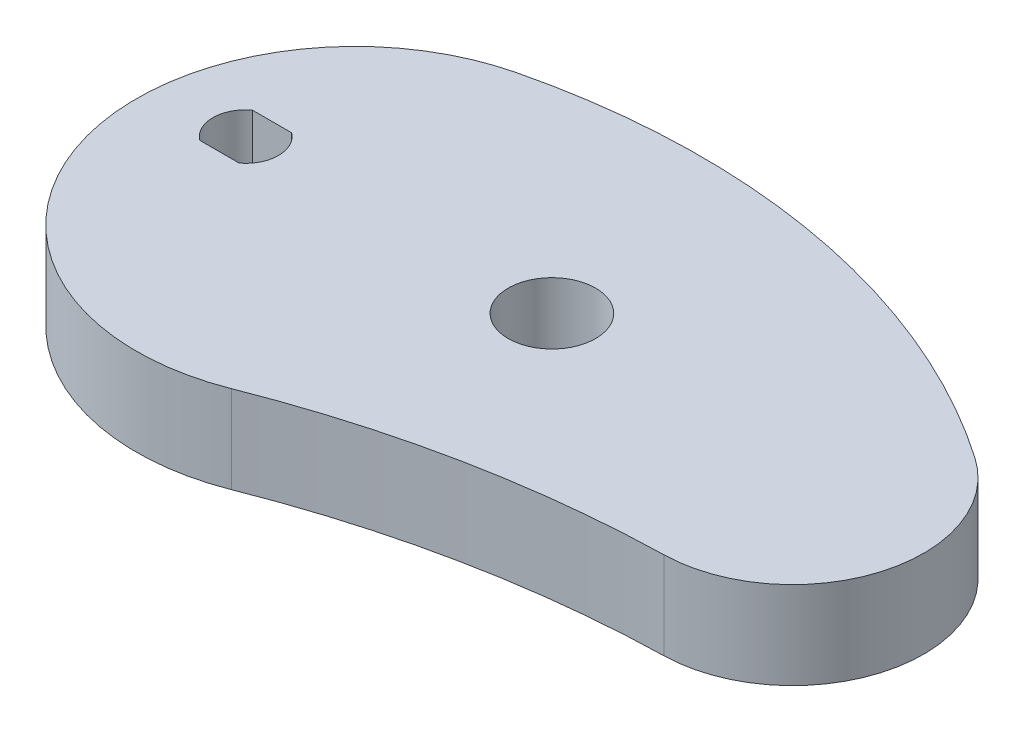
ISO-10303-21;
HEADER;
FILE_DESCRIPTION(('STEP AP214'),'2;1');
FILE_NAME('part.step','',(''),(''),'','','');
FILE_SCHEMA(('AUTOMOTIVE_DESIGN { 1 0 10303 214 1 1 1 1 }'));
ENDSEC;
DATA;
#1=APPLICATION_CONTEXT('core data for automotive mechanical design processes');
#2=APPLICATION_PROTOCOL_DEFINITION('international standard','automotive_design',2000,#1);
#3=PRODUCT_CONTEXT('',#1,'mechanical');
#4=PRODUCT('Part','Part','',(#3));
#5=PRODUCT_RELATED_PRODUCT_CATEGORY('part','',(#4));
#6=PRODUCT_DEFINITION_FORMATION('','',#4);
#7=PRODUCT_DEFINITION_CONTEXT('part definition',#1,'design');
#8=PRODUCT_DEFINITION('design','',#6,#7);
#9=PRODUCT_DEFINITION_SHAPE('','',#8);
#10=(LENGTH_UNIT() NAMED_UNIT(*) SI_UNIT(.MILLI.,.METRE.));
#11=(NAMED_UNIT(*) PLANE_ANGLE_UNIT() SI_UNIT($,.RADIAN.));
#12=(NAMED_UNIT(*) SI_UNIT($,.STERADIAN.) SOLID_ANGLE_UNIT());
#13=UNCERTAINTY_MEASURE_WITH_UNIT(LENGTH_MEASURE(1.E-05),#10,'distance_accuracy_value','');
#14=(GEOMETRIC_REPRESENTATION_CONTEXT(3) GLOBAL_UNCERTAINTY_ASSIGNED_CONTEXT((#13)) GLOBAL_UNIT_ASSIGNED_CONTEXT((#10,
#11,#12)) REPRESENTATION_CONTEXT('',''));
#15=CARTESIAN_POINT('',(0.,0.,0.));
#16=DIRECTION('',(0.,0.,1.));
#17=DIRECTION('',(1.,0.,0.));
#18=AXIS2_PLACEMENT_3D('',#15,#16,#17);
#19=CARTESIAN_POINT('',(80.01,25.4,67.8707772167079));
#20=DIRECTION('',(0.,-1.,0.));
#21=DIRECTION('',(0.,0.,-1.));
#22=AXIS2_PLACEMENT_3D('',#19,#20,#21);
#23=PLANE('',#22);
#24=CARTESIAN_POINT('',(50.8,25.4,-6.35));
#25=DIRECTION('',(0.,1.,0.));
#26=DIRECTION('',(0.,0.,1.));
#27=AXIS2_PLACEMENT_3D('',#24,#25,#26);
#28=CIRCLE('',#27,12.7);
#29=CARTESIAN_POINT('',(50.8,25.4,6.35));
#30=VERTEX_POINT('',#29);
#31=EDGE_CURVE('E137',#30,#30,#28,.T.);
#32=ORIENTED_EDGE('',*,*,#31,.F.);
#33=EDGE_LOOP('',(#32));
#34=FACE_BOUND('',#33,.T.);
#35=CARTESIAN_POINT('',(33.02,25.4,135.741554433416));
#36=DIRECTION('',(0.,1.,0.));
#37=DIRECTION('',(0.,0.,-1.));
#38=AXIS2_PLACEMENT_3D('',#35,#36,#37);
#39=CIRCLE('',#38,203.2);
#40=CARTESIAN_POINT('',(148.687692307692,25.4,-31.3249741000191));
#41=VERTEX_POINT('',#40);
#42=CARTESIAN_POINT('',(-15.0090909090909,25.4,-61.7007065606436));
#43=VERTEX_POINT('',#42);
#44=EDGE_CURVE('E149',#41,#43,#39,.T.);
#45=ORIENTED_EDGE('',*,*,#44,.T.);
#46=CARTESIAN_POINT('',(0.,25.4,0.));
#47=DIRECTION('',(0.,1.,0.));
#48=DIRECTION('',(0.,0.,1.));
#49=AXIS2_PLACEMENT_3D('',#46,#47,#48);
#50=CIRCLE('',#49,63.5);
#51=CARTESIAN_POINT('',(23.2103448275862,25.4,59.1060901513926));
#52=VERTEX_POINT('',#51);
#53=EDGE_CURVE('E152',#43,#52,#50,.T.);
#54=ORIENTED_EDGE('',*,*,#53,.T.);
#55=CARTESIAN_POINT('',(134.62,25.4,342.815322878077));
#56=DIRECTION('',(0.,-1.,0.));
#57=DIRECTION('',(0.,0.,1.));
#58=AXIS2_PLACEMENT_3D('',#55,#56,#57);
#59=CIRCLE('',#58,304.8);
#60=CARTESIAN_POINT('',(127.846666666667,25.4,38.0905914308975));
#61=VERTEX_POINT('',#60);
#62=EDGE_CURVE('E154',#52,#61,#59,.T.);
#63=ORIENTED_EDGE('',*,*,#62,.T.);
#64=CARTESIAN_POINT('',(127.,25.4,0.));
#65=DIRECTION('',(0.,1.,0.));
#66=DIRECTION('',(0.,0.,1.));
#67=AXIS2_PLACEMENT_3D('',#64,#65,#66);
#68=CIRCLE('',#67,38.1000000000001);
#69=EDGE_CURVE('E156',#61,#41,#68,.T.);
#70=ORIENTED_EDGE('',*,*,#69,.T.);
#71=EDGE_LOOP('',(#45,#54,#63,#70));
#72=FACE_BOUND('',#71,.T.);
#73=CARTESIAN_POINT('',(-38.1,25.4,-6.35));
#74=DIRECTION('',(0.,1.,0.));
#75=DIRECTION('',(0.,0.,1.));
#76=AXIS2_PLACEMENT_3D('',#73,#74,#75);
#77=CIRCLE('',#76,9.525);
#78=CARTESIAN_POINT('',(-43.815,25.4,-13.97));
#79=VERTEX_POINT('',#78);
#80=CARTESIAN_POINT('',(-43.815,25.4,1.27));
#81=VERTEX_POINT('',#80);
#82=EDGE_CURVE('E114',#79,#81,#77,.T.);
#83=ORIENTED_EDGE('',*,*,#82,.F.);
#84=DIRECTION('',(-1.,0.,0.));
#85=VECTOR('',#84,1.);
#86=CARTESIAN_POINT('',(-43.815,25.4,-13.97));
#87=LINE('',#86,#85);
#88=CARTESIAN_POINT('',(-32.385,25.4,-13.97));
#89=VERTEX_POINT('',#88);
#90=EDGE_CURVE('E129',#89,#79,#87,.T.);
#91=ORIENTED_EDGE('',*,*,#90,.F.);
#92=CARTESIAN_POINT('',(-38.1,25.4,-6.35));
#93=DIRECTION('',(0.,1.,0.));
#94=DIRECTION('',(0.,0.,1.));
#95=AXIS2_PLACEMENT_3D('',#92,#93,#94);
#96=CIRCLE('',#95,9.525);
#97=CARTESIAN_POINT('',(-32.385,25.4,1.27));
#98=VERTEX_POINT('',#97);
#99=EDGE_CURVE('E127',#98,#89,#96,.T.);
#100=ORIENTED_EDGE('',*,*,#99,.F.);
#101=DIRECTION('',(1.,0.,0.));
#102=VECTOR('',#101,1.);
#103=CARTESIAN_POINT('',(-43.815,25.4,1.27));
#104=LINE('',#103,#102);
#105=EDGE_CURVE('E125',#81,#98,#104,.T.);
#106=ORIENTED_EDGE('',*,*,#105,.F.);
#107=EDGE_LOOP('',(#83,#91,#100,#106));
#108=FACE_BOUND('',#107,.T.);
#109=ADVANCED_FACE('F34',(#34,#72,#108),#23,.F.);
#110=CARTESIAN_POINT('',(80.01,0.,67.8707772167079));
#111=DIRECTION('',(0.,-1.,0.));
#112=DIRECTION('',(0.,0.,-1.));
#113=AXIS2_PLACEMENT_3D('',#110,#111,#112);
#114=PLANE('',#113);
#115=CARTESIAN_POINT('',(50.8,0.,-6.35));
#116=DIRECTION('',(0.,1.,0.));
#117=DIRECTION('',(0.,0.,1.));
#118=AXIS2_PLACEMENT_3D('',#115,#116,#117);
#119=CIRCLE('',#118,12.7);
#120=CARTESIAN_POINT('',(50.8,0.,6.35));
#121=VERTEX_POINT('',#120);
#122=EDGE_CURVE('E115',#121,#121,#119,.T.);
#123=ORIENTED_EDGE('',*,*,#122,.T.);
#124=EDGE_LOOP('',(#123));
#125=FACE_BOUND('',#124,.T.);
#126=CARTESIAN_POINT('',(33.02,0.,135.741554433416));
#127=DIRECTION('',(0.,1.,0.));
#128=DIRECTION('',(0.,0.,-1.));
#129=AXIS2_PLACEMENT_3D('',#126,#127,#128);
#130=CIRCLE('',#129,203.2);
#131=CARTESIAN_POINT('',(148.687692307692,0.,-31.3249741000191));
#132=VERTEX_POINT('',#131);
#133=CARTESIAN_POINT('',(-15.0090909090909,0.,-61.7007065606436));
#134=VERTEX_POINT('',#133);
#135=EDGE_CURVE('E140',#132,#134,#130,.T.);
#136=ORIENTED_EDGE('',*,*,#135,.F.);
#137=CARTESIAN_POINT('',(127.,0.,0.));
#138=DIRECTION('',(0.,1.,0.));
#139=DIRECTION('',(0.,0.,1.));
#140=AXIS2_PLACEMENT_3D('',#137,#138,#139);
#141=CIRCLE('',#140,38.1000000000001);
#142=CARTESIAN_POINT('',(127.846666666667,0.,38.0905914308975));
#143=VERTEX_POINT('',#142);
#144=EDGE_CURVE('E147',#143,#132,#141,.T.);
#145=ORIENTED_EDGE('',*,*,#144,.F.);
#146=CARTESIAN_POINT('',(134.62,0.,342.815322878077));
#147=DIRECTION('',(0.,-1.,0.));
#148=DIRECTION('',(0.,0.,1.));
#149=AXIS2_PLACEMENT_3D('',#146,#147,#148);
#150=CIRCLE('',#149,304.8);
#151=CARTESIAN_POINT('',(23.2103448275862,0.,59.1060901513926));
#152=VERTEX_POINT('',#151);
#153=EDGE_CURVE('E145',#152,#143,#150,.T.);
#154=ORIENTED_EDGE('',*,*,#153,.F.);
#155=CARTESIAN_POINT('',(0.,0.,0.));
#156=DIRECTION('',(0.,1.,0.));
#157=DIRECTION('',(0.,0.,1.));
#158=AXIS2_PLACEMENT_3D('',#155,#156,#157);
#159=CIRCLE('',#158,63.5);
#160=EDGE_CURVE('E143',#134,#152,#159,.T.);
#161=ORIENTED_EDGE('',*,*,#160,.F.);
#162=EDGE_LOOP('',(#136,#145,#154,#161));
#163=FACE_BOUND('',#162,.T.);
#164=DIRECTION('',(-1.,0.,0.));
#165=VECTOR('',#164,1.);
#166=CARTESIAN_POINT('',(-43.815,0.,-13.97));
#167=LINE('',#166,#165);
#168=CARTESIAN_POINT('',(-32.385,0.,-13.97));
#169=VERTEX_POINT('',#168);
#170=CARTESIAN_POINT('',(-43.815,0.,-13.97));
#171=VERTEX_POINT('',#170);
#172=EDGE_CURVE('E119',#169,#171,#167,.T.);
#173=ORIENTED_EDGE('',*,*,#172,.T.);
#174=CARTESIAN_POINT('',(-38.1,0.,-6.35));
#175=DIRECTION('',(0.,1.,0.));
#176=DIRECTION('',(0.,0.,1.));
#177=AXIS2_PLACEMENT_3D('',#174,#175,#176);
#178=CIRCLE('',#177,9.525);
#179=CARTESIAN_POINT('',(-43.815,0.,1.27));
#180=VERTEX_POINT('',#179);
#181=EDGE_CURVE('E57',#171,#180,#178,.T.);
#182=ORIENTED_EDGE('',*,*,#181,.T.);
#183=DIRECTION('',(1.,0.,0.));
#184=VECTOR('',#183,1.);
#185=CARTESIAN_POINT('',(-43.815,0.,1.27));
#186=LINE('',#185,#184);
#187=CARTESIAN_POINT('',(-32.385,0.,1.27));
#188=VERTEX_POINT('',#187);
#189=EDGE_CURVE('E101',#180,#188,#186,.T.);
#190=ORIENTED_EDGE('',*,*,#189,.T.);
#191=CARTESIAN_POINT('',(-38.1,0.,-6.35));
#192=DIRECTION('',(0.,1.,0.));
#193=DIRECTION('',(0.,0.,1.));
#194=AXIS2_PLACEMENT_3D('',#191,#192,#193);
#195=CIRCLE('',#194,9.525);
#196=EDGE_CURVE('E110',#188,#169,#195,.T.);
#197=ORIENTED_EDGE('',*,*,#196,.T.);
#198=EDGE_LOOP('',(#173,#182,#190,#197));
#199=FACE_BOUND('',#198,.T.);
#200=ADVANCED_FACE('F118',(#125,#163,#199),#114,.T.);
#201=CARTESIAN_POINT('',(33.02,25.4,135.741554433416));
#202=DIRECTION('',(0.,-1.,0.));
#203=DIRECTION('',(0.,0.,-1.));
#204=AXIS2_PLACEMENT_3D('',#201,#202,#203);
#205=CYLINDRICAL_SURFACE('',#204,203.2);
#206=ORIENTED_EDGE('',*,*,#135,.T.);
#207=DIRECTION('',(0.,-1.,0.));
#208=VECTOR('',#207,1.);
#209=CARTESIAN_POINT('',(-15.0090909090909,25.4,-61.7007065606436));
#210=LINE('',#209,#208);
#211=EDGE_CURVE('E11',#43,#134,#210,.T.);
#212=ORIENTED_EDGE('',*,*,#211,.F.);
#213=ORIENTED_EDGE('',*,*,#44,.F.);
#214=DIRECTION('',(0.,-1.,0.));
#215=VECTOR('',#214,1.);
#216=CARTESIAN_POINT('',(148.687692307692,25.4,-31.3249741000191));
#217=LINE('',#216,#215);
#218=EDGE_CURVE('E158',#41,#132,#217,.T.);
#219=ORIENTED_EDGE('',*,*,#218,.T.);
#220=EDGE_LOOP('',(#206,#212,#213,#219));
#221=FACE_BOUND('',#220,.T.);
#222=ADVANCED_FACE('F36',(#221),#205,.T.);
#223=CARTESIAN_POINT('',(0.,25.4,0.));
#224=DIRECTION('',(0.,-1.,0.));
#225=DIRECTION('',(0.,0.,-1.));
#226=AXIS2_PLACEMENT_3D('',#223,#224,#225);
#227=CYLINDRICAL_SURFACE('',#226,63.5);
#228=ORIENTED_EDGE('',*,*,#160,.T.);
#229=DIRECTION('',(0.,-1.,0.));
#230=VECTOR('',#229,1.);
#231=CARTESIAN_POINT('',(23.2103448275862,25.4,59.1060901513926));
#232=LINE('',#231,#230);
#233=EDGE_CURVE('E42',#52,#152,#232,.T.);
#234=ORIENTED_EDGE('',*,*,#233,.F.);
#235=ORIENTED_EDGE('',*,*,#53,.F.);
#236=ORIENTED_EDGE('',*,*,#211,.T.);
#237=EDGE_LOOP('',(#228,#234,#235,#236));
#238=FACE_BOUND('',#237,.T.);
#239=ADVANCED_FACE('F183',(#238),#227,.T.);
#240=CARTESIAN_POINT('',(134.62,25.4,342.815322878077));
#241=DIRECTION('',(0.,-1.,0.));
#242=DIRECTION('',(0.,0.,-1.));
#243=AXIS2_PLACEMENT_3D('',#240,#241,#242);
#244=CYLINDRICAL_SURFACE('',#243,304.8);
#245=ORIENTED_EDGE('',*,*,#153,.T.);
#246=DIRECTION('',(0.,-1.,0.));
#247=VECTOR('',#246,1.);
#248=CARTESIAN_POINT('',(127.846666666667,25.4,38.0905914308975));
#249=LINE('',#248,#247);
#250=EDGE_CURVE('E161',#61,#143,#249,.T.);
#251=ORIENTED_EDGE('',*,*,#250,.F.);
#252=ORIENTED_EDGE('',*,*,#62,.F.);
#253=ORIENTED_EDGE('',*,*,#233,.T.);
#254=EDGE_LOOP('',(#245,#251,#252,#253));
#255=FACE_BOUND('',#254,.T.);
#256=ADVANCED_FACE('F168',(#255),#244,.F.);
#257=CARTESIAN_POINT('',(127.,25.4,0.));
#258=DIRECTION('',(0.,-1.,0.));
#259=DIRECTION('',(0.,0.,-1.));
#260=AXIS2_PLACEMENT_3D('',#257,#258,#259);
#261=CYLINDRICAL_SURFACE('',#260,38.1000000000001);
#262=ORIENTED_EDGE('',*,*,#144,.T.);
#263=ORIENTED_EDGE('',*,*,#218,.F.);
#264=ORIENTED_EDGE('',*,*,#69,.F.);
#265=ORIENTED_EDGE('',*,*,#250,.T.);
#266=EDGE_LOOP('',(#262,#263,#264,#265));
#267=FACE_BOUND('',#266,.T.);
#268=ADVANCED_FACE('F176',(#267),#261,.T.);
#269=CARTESIAN_POINT('',(50.8,25.4,-6.35));
#270=DIRECTION('',(0.,-1.,0.));
#271=DIRECTION('',(0.,0.,-1.));
#272=AXIS2_PLACEMENT_3D('',#269,#270,#271);
#273=CYLINDRICAL_SURFACE('',#272,12.7);
#274=ORIENTED_EDGE('',*,*,#31,.T.);
#275=EDGE_LOOP('',(#274));
#276=FACE_BOUND('',#275,.T.);
#277=ORIENTED_EDGE('',*,*,#122,.F.);
#278=EDGE_LOOP('',(#277));
#279=FACE_BOUND('',#278,.T.);
#280=ADVANCED_FACE('F202',(#276,#279),#273,.F.);
#281=CARTESIAN_POINT('',(-38.1,25.4,-6.35));
#282=DIRECTION('',(0.,-1.,0.));
#283=DIRECTION('',(0.,0.,-1.));
#284=AXIS2_PLACEMENT_3D('',#281,#282,#283);
#285=CYLINDRICAL_SURFACE('',#284,9.525);
#286=ORIENTED_EDGE('',*,*,#181,.F.);
#287=DIRECTION('',(0.,-1.,0.));
#288=VECTOR('',#287,1.);
#289=CARTESIAN_POINT('',(-43.815,25.4,-13.97));
#290=LINE('',#289,#288);
#291=EDGE_CURVE('E131',#79,#171,#290,.T.);
#292=ORIENTED_EDGE('',*,*,#291,.F.);
#293=ORIENTED_EDGE('',*,*,#82,.T.);
#294=DIRECTION('',(0.,-1.,0.));
#295=VECTOR('',#294,1.);
#296=CARTESIAN_POINT('',(-43.815,25.4,1.27));
#297=LINE('',#296,#295);
#298=EDGE_CURVE('E103',#81,#180,#297,.T.);
#299=ORIENTED_EDGE('',*,*,#298,.T.);
#300=EDGE_LOOP('',(#286,#292,#293,#299));
#301=FACE_BOUND('',#300,.T.);
#302=ADVANCED_FACE('F112',(#301),#285,.F.);
#303=CARTESIAN_POINT('',(-43.815,25.4,1.27));
#304=DIRECTION('',(0.,0.,-1.));
#305=DIRECTION('',(-1.,0.,0.));
#306=AXIS2_PLACEMENT_3D('',#303,#304,#305);
#307=PLANE('',#306);
#308=ORIENTED_EDGE('',*,*,#189,.F.);
#309=ORIENTED_EDGE('',*,*,#298,.F.);
#310=ORIENTED_EDGE('',*,*,#105,.T.);
#311=DIRECTION('',(0.,-1.,0.));
#312=VECTOR('',#311,1.);
#313=CARTESIAN_POINT('',(-32.385,25.4,1.27));
#314=LINE('',#313,#312);
#315=EDGE_CURVE('E106',#98,#188,#314,.T.);
#316=ORIENTED_EDGE('',*,*,#315,.T.);
#317=EDGE_LOOP('',(#308,#309,#310,#316));
#318=FACE_BOUND('',#317,.T.);
#319=ADVANCED_FACE('F102',(#318),#307,.T.);
#320=CARTESIAN_POINT('',(-38.1,25.4,-6.35));
#321=DIRECTION('',(0.,-1.,0.));
#322=DIRECTION('',(0.,0.,-1.));
#323=AXIS2_PLACEMENT_3D('',#320,#321,#322);
#324=CYLINDRICAL_SURFACE('',#323,9.525);
#325=ORIENTED_EDGE('',*,*,#196,.F.);
#326=ORIENTED_EDGE('',*,*,#315,.F.);
#327=ORIENTED_EDGE('',*,*,#99,.T.);
#328=DIRECTION('',(0.,-1.,0.));
#329=VECTOR('',#328,1.);
#330=CARTESIAN_POINT('',(-32.385,25.4,-13.97));
#331=LINE('',#330,#329);
#332=EDGE_CURVE('E49',#89,#169,#331,.T.);
#333=ORIENTED_EDGE('',*,*,#332,.T.);
#334=EDGE_LOOP('',(#325,#326,#327,#333));
#335=FACE_BOUND('',#334,.T.);
#336=ADVANCED_FACE('F215',(#335),#324,.F.);
#337=CARTESIAN_POINT('',(-43.815,25.4,-13.97));
#338=DIRECTION('',(0.,0.,1.));
#339=DIRECTION('',(1.,0.,0.));
#340=AXIS2_PLACEMENT_3D('',#337,#338,#339);
#341=PLANE('',#340);
#342=ORIENTED_EDGE('',*,*,#172,.F.);
#343=ORIENTED_EDGE('',*,*,#332,.F.);
#344=ORIENTED_EDGE('',*,*,#90,.T.);
#345=ORIENTED_EDGE('',*,*,#291,.T.);
#346=EDGE_LOOP('',(#342,#343,#344,#345));
#347=FACE_BOUND('',#346,.T.);
#348=ADVANCED_FACE('F218',(#347),#341,.T.);
#349=CLOSED_SHELL('',(#109,#200,#222,#239,#256,#268,#280,#302,#319,#336,#348));
#350=MANIFOLD_SOLID_BREP('B2',#349);
#351=ADVANCED_BREP_SHAPE_REPRESENTATION('',(#18,#350),#14);
#352=SHAPE_DEFINITION_REPRESENTATION(#9,#351);
ENDSEC;
END-ISO-10303-21;
